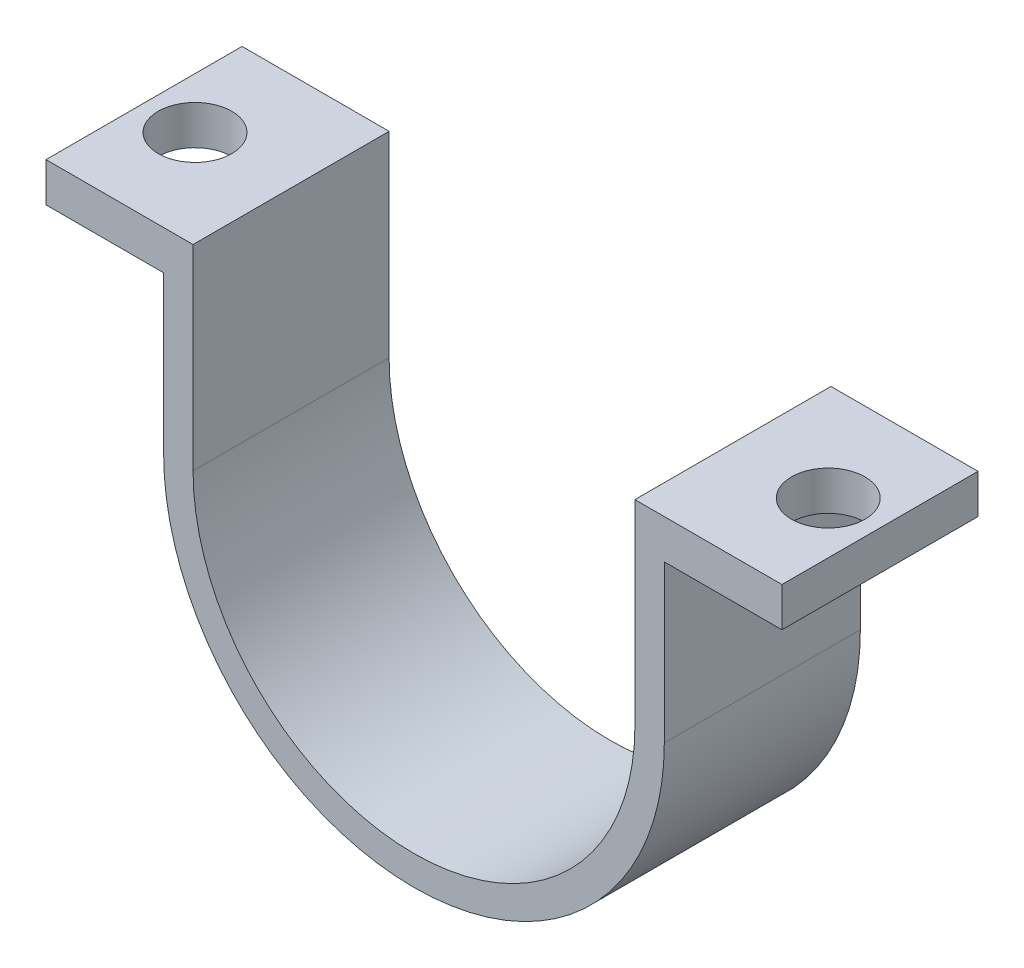
ISO-10303-21;
HEADER;
FILE_DESCRIPTION(('STEP AP214'),'2;1');
FILE_NAME('part.step','',(''),(''),'','','');
FILE_SCHEMA(('AUTOMOTIVE_DESIGN { 1 0 10303 214 1 1 1 1 }'));
ENDSEC;
DATA;
#1=APPLICATION_CONTEXT('core data for automotive mechanical design processes');
#2=APPLICATION_PROTOCOL_DEFINITION('international standard','automotive_design',2000,#1);
#3=PRODUCT_CONTEXT('',#1,'mechanical');
#4=PRODUCT('Part','Part','',(#3));
#5=PRODUCT_RELATED_PRODUCT_CATEGORY('part','',(#4));
#6=PRODUCT_DEFINITION_FORMATION('','',#4);
#7=PRODUCT_DEFINITION_CONTEXT('part definition',#1,'design');
#8=PRODUCT_DEFINITION('design','',#6,#7);
#9=PRODUCT_DEFINITION_SHAPE('','',#8);
#10=(LENGTH_UNIT() NAMED_UNIT(*) SI_UNIT(.MILLI.,.METRE.));
#11=(NAMED_UNIT(*) PLANE_ANGLE_UNIT() SI_UNIT($,.RADIAN.));
#12=(NAMED_UNIT(*) SI_UNIT($,.STERADIAN.) SOLID_ANGLE_UNIT());
#13=UNCERTAINTY_MEASURE_WITH_UNIT(LENGTH_MEASURE(1.E-05),#10,'distance_accuracy_value','');
#14=(GEOMETRIC_REPRESENTATION_CONTEXT(3) GLOBAL_UNCERTAINTY_ASSIGNED_CONTEXT((#13)) GLOBAL_UNIT_ASSIGNED_CONTEXT((#10,
#11,#12)) REPRESENTATION_CONTEXT('',''));
#15=CARTESIAN_POINT('',(0.,0.,0.));
#16=DIRECTION('',(0.,0.,1.));
#17=DIRECTION('',(1.,0.,0.));
#18=AXIS2_PLACEMENT_3D('',#15,#16,#17);
#19=CARTESIAN_POINT('',(0.0481877124280383,-5.08,25.4));
#20=DIRECTION('',(0.,0.,-1.));
#21=DIRECTION('',(-1.,0.,0.));
#22=AXIS2_PLACEMENT_3D('',#19,#20,#21);
#23=CYLINDRICAL_SURFACE('',#22,32.433187712428);
#24=CARTESIAN_POINT('',(0.0481877124280383,-5.08,0.));
#25=DIRECTION('',(0.,0.,1.));
#26=DIRECTION('',(-1.,0.,0.));
#27=AXIS2_PLACEMENT_3D('',#24,#25,#26);
#28=CIRCLE('',#27,32.433187712428);
#29=CARTESIAN_POINT('',(-32.3849999999999,-5.08,0.));
#30=VERTEX_POINT('',#29);
#31=CARTESIAN_POINT('',(32.481375424856,-5.08,0.));
#32=VERTEX_POINT('',#31);
#33=EDGE_CURVE('E165',#30,#32,#28,.T.);
#34=ORIENTED_EDGE('',*,*,#33,.T.);
#35=DIRECTION('',(0.,0.,-1.));
#36=VECTOR('',#35,1.);
#37=CARTESIAN_POINT('',(32.481375424856,-5.08,25.4));
#38=LINE('',#37,#36);
#39=CARTESIAN_POINT('',(32.481375424856,-5.08,25.4));
#40=VERTEX_POINT('',#39);
#41=EDGE_CURVE('E11',#40,#32,#38,.T.);
#42=ORIENTED_EDGE('',*,*,#41,.F.);
#43=CARTESIAN_POINT('',(0.0481877124280383,-5.08,25.4));
#44=DIRECTION('',(0.,0.,1.));
#45=DIRECTION('',(-1.,0.,0.));
#46=AXIS2_PLACEMENT_3D('',#43,#44,#45);
#47=CIRCLE('',#46,32.433187712428);
#48=CARTESIAN_POINT('',(-32.3849999999999,-5.08,25.4));
#49=VERTEX_POINT('',#48);
#50=EDGE_CURVE('E200',#49,#40,#47,.T.);
#51=ORIENTED_EDGE('',*,*,#50,.F.);
#52=DIRECTION('',(0.,0.,-1.));
#53=VECTOR('',#52,1.);
#54=CARTESIAN_POINT('',(-32.3849999999999,-5.08,25.4));
#55=LINE('',#54,#53);
#56=EDGE_CURVE('E161',#49,#30,#55,.T.);
#57=ORIENTED_EDGE('',*,*,#56,.T.);
#58=EDGE_LOOP('',(#34,#42,#51,#57));
#59=FACE_BOUND('',#58,.T.);
#60=ADVANCED_FACE('F39',(#59),#23,.T.);
#61=CARTESIAN_POINT('',(32.481375424856,-5.08,25.4));
#62=DIRECTION('',(-1.,0.,0.));
#63=DIRECTION('',(0.,-1.,0.));
#64=AXIS2_PLACEMENT_3D('',#61,#62,#63);
#65=PLANE('',#64);
#66=DIRECTION('',(0.,1.,0.));
#67=VECTOR('',#66,1.);
#68=CARTESIAN_POINT('',(32.481375424856,-5.08,0.));
#69=LINE('',#68,#67);
#70=CARTESIAN_POINT('',(32.481375424856,15.24,0.));
#71=VERTEX_POINT('',#70);
#72=EDGE_CURVE('E169',#32,#71,#69,.T.);
#73=ORIENTED_EDGE('',*,*,#72,.T.);
#74=DIRECTION('',(0.,0.,-1.));
#75=VECTOR('',#74,1.);
#76=CARTESIAN_POINT('',(32.481375424856,15.24,25.4));
#77=LINE('',#76,#75);
#78=CARTESIAN_POINT('',(32.481375424856,15.24,25.4));
#79=VERTEX_POINT('',#78);
#80=EDGE_CURVE('E49',#79,#71,#77,.T.);
#81=ORIENTED_EDGE('',*,*,#80,.F.);
#82=DIRECTION('',(0.,1.,0.));
#83=VECTOR('',#82,1.);
#84=CARTESIAN_POINT('',(32.481375424856,-5.08,25.4));
#85=LINE('',#84,#83);
#86=EDGE_CURVE('E112',#40,#79,#85,.T.);
#87=ORIENTED_EDGE('',*,*,#86,.F.);
#88=ORIENTED_EDGE('',*,*,#41,.T.);
#89=EDGE_LOOP('',(#73,#81,#87,#88));
#90=FACE_BOUND('',#89,.T.);
#91=ADVANCED_FACE('F296',(#90),#65,.F.);
#92=CARTESIAN_POINT('',(32.481375424856,15.24,25.4));
#93=DIRECTION('',(0.,1.,0.));
#94=DIRECTION('',(0.,0.,1.));
#95=AXIS2_PLACEMENT_3D('',#92,#93,#94);
#96=PLANE('',#95);
#97=CARTESIAN_POINT('',(41.021,15.24,12.7));
#98=DIRECTION('',(0.,1.,0.));
#99=DIRECTION('',(0.,0.,1.));
#100=AXIS2_PLACEMENT_3D('',#97,#98,#99);
#101=CIRCLE('',#100,4.7625);
#102=CARTESIAN_POINT('',(36.2585,15.24,12.7));
#103=VERTEX_POINT('',#102);
#104=EDGE_CURVE('E170',#103,#103,#101,.T.);
#105=ORIENTED_EDGE('',*,*,#104,.T.);
#106=EDGE_LOOP('',(#105));
#107=FACE_BOUND('',#106,.T.);
#108=DIRECTION('',(1.,0.,0.));
#109=VECTOR('',#108,1.);
#110=CARTESIAN_POINT('',(32.481375424856,15.24,0.));
#111=LINE('',#110,#109);
#112=CARTESIAN_POINT('',(47.721375424856,15.24,0.));
#113=VERTEX_POINT('',#112);
#114=EDGE_CURVE('E173',#71,#113,#111,.T.);
#115=ORIENTED_EDGE('',*,*,#114,.T.);
#116=DIRECTION('',(0.,0.,-1.));
#117=VECTOR('',#116,1.);
#118=CARTESIAN_POINT('',(47.721375424856,15.24,25.4));
#119=LINE('',#118,#117);
#120=CARTESIAN_POINT('',(47.721375424856,15.24,25.4));
#121=VERTEX_POINT('',#120);
#122=EDGE_CURVE('E227',#121,#113,#119,.T.);
#123=ORIENTED_EDGE('',*,*,#122,.F.);
#124=DIRECTION('',(1.,0.,0.));
#125=VECTOR('',#124,1.);
#126=CARTESIAN_POINT('',(32.481375424856,15.24,25.4));
#127=LINE('',#126,#125);
#128=EDGE_CURVE('E238',#79,#121,#127,.T.);
#129=ORIENTED_EDGE('',*,*,#128,.F.);
#130=ORIENTED_EDGE('',*,*,#80,.T.);
#131=EDGE_LOOP('',(#115,#123,#129,#130));
#132=FACE_BOUND('',#131,.T.);
#133=ADVANCED_FACE('F236',(#107,#132),#96,.F.);
#134=CARTESIAN_POINT('',(47.721375424856,15.24,25.4));
#135=DIRECTION('',(-1.,0.,0.));
#136=DIRECTION('',(0.,0.,1.));
#137=AXIS2_PLACEMENT_3D('',#134,#135,#136);
#138=PLANE('',#137);
#139=DIRECTION('',(0.,1.,0.));
#140=VECTOR('',#139,1.);
#141=CARTESIAN_POINT('',(47.721375424856,15.24,0.));
#142=LINE('',#141,#140);
#143=CARTESIAN_POINT('',(47.721375424856,20.32,0.));
#144=VERTEX_POINT('',#143);
#145=EDGE_CURVE('E176',#113,#144,#142,.T.);
#146=ORIENTED_EDGE('',*,*,#145,.T.);
#147=DIRECTION('',(0.,0.,-1.));
#148=VECTOR('',#147,1.);
#149=CARTESIAN_POINT('',(47.721375424856,20.32,25.4));
#150=LINE('',#149,#148);
#151=CARTESIAN_POINT('',(47.721375424856,20.32,25.4));
#152=VERTEX_POINT('',#151);
#153=EDGE_CURVE('E223',#152,#144,#150,.T.);
#154=ORIENTED_EDGE('',*,*,#153,.F.);
#155=DIRECTION('',(0.,1.,0.));
#156=VECTOR('',#155,1.);
#157=CARTESIAN_POINT('',(47.721375424856,15.24,25.4));
#158=LINE('',#157,#156);
#159=EDGE_CURVE('E257',#121,#152,#158,.T.);
#160=ORIENTED_EDGE('',*,*,#159,.F.);
#161=ORIENTED_EDGE('',*,*,#122,.T.);
#162=EDGE_LOOP('',(#146,#154,#160,#161));
#163=FACE_BOUND('',#162,.T.);
#164=ADVANCED_FACE('F247',(#163),#138,.F.);
#165=CARTESIAN_POINT('',(47.721375424856,20.32,25.4));
#166=DIRECTION('',(0.,-1.,0.));
#167=DIRECTION('',(1.,0.,0.));
#168=AXIS2_PLACEMENT_3D('',#165,#166,#167);
#169=PLANE('',#168);
#170=CARTESIAN_POINT('',(41.021,20.32,12.7));
#171=DIRECTION('',(0.,1.,0.));
#172=DIRECTION('',(-1.,0.,0.));
#173=AXIS2_PLACEMENT_3D('',#170,#171,#172);
#174=CIRCLE('',#173,4.7625);
#175=CARTESIAN_POINT('',(36.2585,20.32,12.7));
#176=VERTEX_POINT('',#175);
#177=EDGE_CURVE('E427',#176,#176,#174,.T.);
#178=ORIENTED_EDGE('',*,*,#177,.F.);
#179=EDGE_LOOP('',(#178));
#180=FACE_BOUND('',#179,.T.);
#181=DIRECTION('',(-1.,0.,0.));
#182=VECTOR('',#181,1.);
#183=CARTESIAN_POINT('',(47.721375424856,20.32,0.));
#184=LINE('',#183,#182);
#185=CARTESIAN_POINT('',(28.671375424856,20.32,0.));
#186=VERTEX_POINT('',#185);
#187=EDGE_CURVE('E179',#144,#186,#184,.T.);
#188=ORIENTED_EDGE('',*,*,#187,.T.);
#189=DIRECTION('',(0.,0.,-1.));
#190=VECTOR('',#189,1.);
#191=CARTESIAN_POINT('',(28.671375424856,20.32,25.4));
#192=LINE('',#191,#190);
#193=CARTESIAN_POINT('',(28.671375424856,20.32,25.4));
#194=VERTEX_POINT('',#193);
#195=EDGE_CURVE('E219',#194,#186,#192,.T.);
#196=ORIENTED_EDGE('',*,*,#195,.F.);
#197=DIRECTION('',(-1.,0.,0.));
#198=VECTOR('',#197,1.);
#199=CARTESIAN_POINT('',(47.721375424856,20.32,25.4));
#200=LINE('',#199,#198);
#201=EDGE_CURVE('E253',#152,#194,#200,.T.);
#202=ORIENTED_EDGE('',*,*,#201,.F.);
#203=ORIENTED_EDGE('',*,*,#153,.T.);
#204=EDGE_LOOP('',(#188,#196,#202,#203));
#205=FACE_BOUND('',#204,.T.);
#206=ADVANCED_FACE('F251',(#180,#205),#169,.F.);
#207=CARTESIAN_POINT('',(28.671375424856,20.32,25.4));
#208=DIRECTION('',(1.,0.,0.));
#209=DIRECTION('',(0.,1.,0.));
#210=AXIS2_PLACEMENT_3D('',#207,#208,#209);
#211=PLANE('',#210);
#212=DIRECTION('',(0.,-1.,0.));
#213=VECTOR('',#212,1.);
#214=CARTESIAN_POINT('',(28.671375424856,20.32,0.));
#215=LINE('',#214,#213);
#216=CARTESIAN_POINT('',(28.671375424856,-5.07999999999999,0.));
#217=VERTEX_POINT('',#216);
#218=EDGE_CURVE('E182',#186,#217,#215,.T.);
#219=ORIENTED_EDGE('',*,*,#218,.T.);
#220=DIRECTION('',(0.,0.,-1.));
#221=VECTOR('',#220,1.);
#222=CARTESIAN_POINT('',(28.671375424856,-5.07999999999999,25.4));
#223=LINE('',#222,#221);
#224=CARTESIAN_POINT('',(28.671375424856,-5.07999999999999,25.4));
#225=VERTEX_POINT('',#224);
#226=EDGE_CURVE('E215',#225,#217,#223,.T.);
#227=ORIENTED_EDGE('',*,*,#226,.F.);
#228=DIRECTION('',(0.,-1.,0.));
#229=VECTOR('',#228,1.);
#230=CARTESIAN_POINT('',(28.671375424856,20.32,25.4));
#231=LINE('',#230,#229);
#232=EDGE_CURVE('E256',#194,#225,#231,.T.);
#233=ORIENTED_EDGE('',*,*,#232,.F.);
#234=ORIENTED_EDGE('',*,*,#195,.T.);
#235=EDGE_LOOP('',(#219,#227,#233,#234));
#236=FACE_BOUND('',#235,.T.);
#237=ADVANCED_FACE('F310',(#236),#211,.F.);
#238=CARTESIAN_POINT('',(0.0481877124280132,-5.08,25.4));
#239=DIRECTION('',(0.,0.,-1.));
#240=DIRECTION('',(-1.,0.,0.));
#241=AXIS2_PLACEMENT_3D('',#238,#239,#240);
#242=CYLINDRICAL_SURFACE('',#241,28.623187712428);
#243=CARTESIAN_POINT('',(0.0481877124280132,-5.08,0.));
#244=DIRECTION('',(0.,0.,-1.));
#245=DIRECTION('',(1.,0.,0.));
#246=AXIS2_PLACEMENT_3D('',#243,#244,#245);
#247=CIRCLE('',#246,28.623187712428);
#248=CARTESIAN_POINT('',(-28.575,-5.07999999999993,0.));
#249=VERTEX_POINT('',#248);
#250=EDGE_CURVE('E185',#217,#249,#247,.T.);
#251=ORIENTED_EDGE('',*,*,#250,.T.);
#252=DIRECTION('',(0.,0.,-1.));
#253=VECTOR('',#252,1.);
#254=CARTESIAN_POINT('',(-28.575,-5.07999999999993,25.4));
#255=LINE('',#254,#253);
#256=CARTESIAN_POINT('',(-28.575,-5.07999999999993,25.4));
#257=VERTEX_POINT('',#256);
#258=EDGE_CURVE('E211',#257,#249,#255,.T.);
#259=ORIENTED_EDGE('',*,*,#258,.F.);
#260=CARTESIAN_POINT('',(0.0481877124280132,-5.08,25.4));
#261=DIRECTION('',(0.,0.,-1.));
#262=DIRECTION('',(1.,0.,0.));
#263=AXIS2_PLACEMENT_3D('',#260,#261,#262);
#264=CIRCLE('',#263,28.623187712428);
#265=EDGE_CURVE('E261',#225,#257,#264,.T.);
#266=ORIENTED_EDGE('',*,*,#265,.F.);
#267=ORIENTED_EDGE('',*,*,#226,.T.);
#268=EDGE_LOOP('',(#251,#259,#266,#267));
#269=FACE_BOUND('',#268,.T.);
#270=ADVANCED_FACE('F314',(#269),#242,.F.);
#271=CARTESIAN_POINT('',(-28.5749999999999,20.32,25.4));
#272=DIRECTION('',(-1.,0.,0.));
#273=DIRECTION('',(0.,-1.,0.));
#274=AXIS2_PLACEMENT_3D('',#271,#272,#273);
#275=PLANE('',#274);
#276=DIRECTION('',(0.,1.,0.));
#277=VECTOR('',#276,1.);
#278=CARTESIAN_POINT('',(-28.5749999999999,20.32,0.));
#279=LINE('',#278,#277);
#280=CARTESIAN_POINT('',(-28.5749999999999,20.32,0.));
#281=VERTEX_POINT('',#280);
#282=EDGE_CURVE('E188',#249,#281,#279,.T.);
#283=ORIENTED_EDGE('',*,*,#282,.T.);
#284=DIRECTION('',(0.,0.,-1.));
#285=VECTOR('',#284,1.);
#286=CARTESIAN_POINT('',(-28.5749999999999,20.32,25.4));
#287=LINE('',#286,#285);
#288=CARTESIAN_POINT('',(-28.5749999999999,20.32,25.4));
#289=VERTEX_POINT('',#288);
#290=EDGE_CURVE('E207',#289,#281,#287,.T.);
#291=ORIENTED_EDGE('',*,*,#290,.F.);
#292=DIRECTION('',(0.,1.,0.));
#293=VECTOR('',#292,1.);
#294=CARTESIAN_POINT('',(-28.5749999999999,20.32,25.4));
#295=LINE('',#294,#293);
#296=EDGE_CURVE('E268',#257,#289,#295,.T.);
#297=ORIENTED_EDGE('',*,*,#296,.F.);
#298=ORIENTED_EDGE('',*,*,#258,.T.);
#299=EDGE_LOOP('',(#283,#291,#297,#298));
#300=FACE_BOUND('',#299,.T.);
#301=ADVANCED_FACE('F276',(#300),#275,.F.);
#302=CARTESIAN_POINT('',(-47.6249999999999,20.32,25.4));
#303=DIRECTION('',(0.,-1.,0.));
#304=DIRECTION('',(0.,0.,-1.));
#305=AXIS2_PLACEMENT_3D('',#302,#303,#304);
#306=PLANE('',#305);
#307=CARTESIAN_POINT('',(-41.021,20.32,12.7));
#308=DIRECTION('',(0.,1.,0.));
#309=DIRECTION('',(-1.,0.,0.));
#310=AXIS2_PLACEMENT_3D('',#307,#308,#309);
#311=CIRCLE('',#310,4.7625);
#312=CARTESIAN_POINT('',(-45.7835,20.32,12.7));
#313=VERTEX_POINT('',#312);
#314=EDGE_CURVE('E434',#313,#313,#311,.T.);
#315=ORIENTED_EDGE('',*,*,#314,.F.);
#316=EDGE_LOOP('',(#315));
#317=FACE_BOUND('',#316,.T.);
#318=DIRECTION('',(-1.,0.,0.));
#319=VECTOR('',#318,1.);
#320=CARTESIAN_POINT('',(-47.6249999999999,20.32,0.));
#321=LINE('',#320,#319);
#322=CARTESIAN_POINT('',(-47.6249999999999,20.32,0.));
#323=VERTEX_POINT('',#322);
#324=EDGE_CURVE('E191',#281,#323,#321,.T.);
#325=ORIENTED_EDGE('',*,*,#324,.T.);
#326=DIRECTION('',(0.,0.,-1.));
#327=VECTOR('',#326,1.);
#328=CARTESIAN_POINT('',(-47.6249999999999,20.32,25.4));
#329=LINE('',#328,#327);
#330=CARTESIAN_POINT('',(-47.6249999999999,20.32,25.4));
#331=VERTEX_POINT('',#330);
#332=EDGE_CURVE('E154',#331,#323,#329,.T.);
#333=ORIENTED_EDGE('',*,*,#332,.F.);
#334=DIRECTION('',(-1.,0.,0.));
#335=VECTOR('',#334,1.);
#336=CARTESIAN_POINT('',(-47.6249999999999,20.32,25.4));
#337=LINE('',#336,#335);
#338=EDGE_CURVE('E143',#289,#331,#337,.T.);
#339=ORIENTED_EDGE('',*,*,#338,.F.);
#340=ORIENTED_EDGE('',*,*,#290,.T.);
#341=EDGE_LOOP('',(#325,#333,#339,#340));
#342=FACE_BOUND('',#341,.T.);
#343=ADVANCED_FACE('F280',(#317,#342),#306,.F.);
#344=CARTESIAN_POINT('',(-47.6249999999999,15.24,25.4));
#345=DIRECTION('',(1.,0.,0.));
#346=DIRECTION('',(0.,0.,-1.));
#347=AXIS2_PLACEMENT_3D('',#344,#345,#346);
#348=PLANE('',#347);
#349=DIRECTION('',(0.,-1.,0.));
#350=VECTOR('',#349,1.);
#351=CARTESIAN_POINT('',(-47.6249999999999,15.24,0.));
#352=LINE('',#351,#350);
#353=CARTESIAN_POINT('',(-47.6249999999999,15.24,0.));
#354=VERTEX_POINT('',#353);
#355=EDGE_CURVE('E152',#323,#354,#352,.T.);
#356=ORIENTED_EDGE('',*,*,#355,.T.);
#357=DIRECTION('',(0.,0.,-1.));
#358=VECTOR('',#357,1.);
#359=CARTESIAN_POINT('',(-47.6249999999999,15.24,25.4));
#360=LINE('',#359,#358);
#361=CARTESIAN_POINT('',(-47.6249999999999,15.24,25.4));
#362=VERTEX_POINT('',#361);
#363=EDGE_CURVE('E149',#362,#354,#360,.T.);
#364=ORIENTED_EDGE('',*,*,#363,.F.);
#365=DIRECTION('',(0.,-1.,0.));
#366=VECTOR('',#365,1.);
#367=CARTESIAN_POINT('',(-47.6249999999999,15.24,25.4));
#368=LINE('',#367,#366);
#369=EDGE_CURVE('E137',#331,#362,#368,.T.);
#370=ORIENTED_EDGE('',*,*,#369,.F.);
#371=ORIENTED_EDGE('',*,*,#332,.T.);
#372=EDGE_LOOP('',(#356,#364,#370,#371));
#373=FACE_BOUND('',#372,.T.);
#374=ADVANCED_FACE('F150',(#373),#348,.F.);
#375=CARTESIAN_POINT('',(-32.3849999999999,15.24,25.4));
#376=DIRECTION('',(0.,1.,0.));
#377=DIRECTION('',(-1.,0.,0.));
#378=AXIS2_PLACEMENT_3D('',#375,#376,#377);
#379=PLANE('',#378);
#380=CARTESIAN_POINT('',(-41.021,15.24,12.7));
#381=DIRECTION('',(0.,1.,0.));
#382=DIRECTION('',(-1.,0.,0.));
#383=AXIS2_PLACEMENT_3D('',#380,#381,#382);
#384=CIRCLE('',#383,4.7625);
#385=CARTESIAN_POINT('',(-45.7835,15.24,12.7));
#386=VERTEX_POINT('',#385);
#387=EDGE_CURVE('E42',#386,#386,#384,.T.);
#388=ORIENTED_EDGE('',*,*,#387,.T.);
#389=EDGE_LOOP('',(#388));
#390=FACE_BOUND('',#389,.T.);
#391=DIRECTION('',(1.,0.,0.));
#392=VECTOR('',#391,1.);
#393=CARTESIAN_POINT('',(-32.3849999999999,15.24,0.));
#394=LINE('',#393,#392);
#395=CARTESIAN_POINT('',(-32.3849999999999,15.24,0.));
#396=VERTEX_POINT('',#395);
#397=EDGE_CURVE('E98',#354,#396,#394,.T.);
#398=ORIENTED_EDGE('',*,*,#397,.T.);
#399=DIRECTION('',(0.,0.,-1.));
#400=VECTOR('',#399,1.);
#401=CARTESIAN_POINT('',(-32.3849999999999,15.24,25.4));
#402=LINE('',#401,#400);
#403=CARTESIAN_POINT('',(-32.3849999999999,15.24,25.4));
#404=VERTEX_POINT('',#403);
#405=EDGE_CURVE('E155',#404,#396,#402,.T.);
#406=ORIENTED_EDGE('',*,*,#405,.F.);
#407=DIRECTION('',(1.,0.,0.));
#408=VECTOR('',#407,1.);
#409=CARTESIAN_POINT('',(-32.3849999999999,15.24,25.4));
#410=LINE('',#409,#408);
#411=EDGE_CURVE('E141',#362,#404,#410,.T.);
#412=ORIENTED_EDGE('',*,*,#411,.F.);
#413=ORIENTED_EDGE('',*,*,#363,.T.);
#414=EDGE_LOOP('',(#398,#406,#412,#413));
#415=FACE_BOUND('',#414,.T.);
#416=ADVANCED_FACE('F157',(#390,#415),#379,.F.);
#417=CARTESIAN_POINT('',(-32.3849999999999,-5.08,25.4));
#418=DIRECTION('',(1.,0.,0.));
#419=DIRECTION('',(0.,1.,0.));
#420=AXIS2_PLACEMENT_3D('',#417,#418,#419);
#421=PLANE('',#420);
#422=DIRECTION('',(0.,-1.,0.));
#423=VECTOR('',#422,1.);
#424=CARTESIAN_POINT('',(-32.3849999999999,-5.08,0.));
#425=LINE('',#424,#423);
#426=EDGE_CURVE('E104',#396,#30,#425,.T.);
#427=ORIENTED_EDGE('',*,*,#426,.T.);
#428=ORIENTED_EDGE('',*,*,#56,.F.);
#429=DIRECTION('',(0.,-1.,0.));
#430=VECTOR('',#429,1.);
#431=CARTESIAN_POINT('',(-32.3849999999999,-5.08,25.4));
#432=LINE('',#431,#430);
#433=EDGE_CURVE('E57',#404,#49,#432,.T.);
#434=ORIENTED_EDGE('',*,*,#433,.F.);
#435=ORIENTED_EDGE('',*,*,#405,.T.);
#436=EDGE_LOOP('',(#427,#428,#434,#435));
#437=FACE_BOUND('',#436,.T.);
#438=ADVANCED_FACE('F284',(#437),#421,.F.);
#439=CARTESIAN_POINT('',(0.0481877124280383,-5.08,25.4));
#440=DIRECTION('',(0.,0.,-1.));
#441=DIRECTION('',(-1.,0.,0.));
#442=AXIS2_PLACEMENT_3D('',#439,#440,#441);
#443=PLANE('',#442);
#444=ORIENTED_EDGE('',*,*,#50,.T.);
#445=ORIENTED_EDGE('',*,*,#86,.T.);
#446=ORIENTED_EDGE('',*,*,#128,.T.);
#447=ORIENTED_EDGE('',*,*,#159,.T.);
#448=ORIENTED_EDGE('',*,*,#201,.T.);
#449=ORIENTED_EDGE('',*,*,#232,.T.);
#450=ORIENTED_EDGE('',*,*,#265,.T.);
#451=ORIENTED_EDGE('',*,*,#296,.T.);
#452=ORIENTED_EDGE('',*,*,#338,.T.);
#453=ORIENTED_EDGE('',*,*,#369,.T.);
#454=ORIENTED_EDGE('',*,*,#411,.T.);
#455=ORIENTED_EDGE('',*,*,#433,.T.);
#456=EDGE_LOOP('',(#444,#445,#446,#447,#448,#449,#450,#451,#452,#453,#454,#455));
#457=FACE_BOUND('',#456,.T.);
#458=ADVANCED_FACE('F139',(#457),#443,.F.);
#459=CARTESIAN_POINT('',(0.0481877124280383,-5.08,0.));
#460=DIRECTION('',(0.,0.,-1.));
#461=DIRECTION('',(-1.,0.,0.));
#462=AXIS2_PLACEMENT_3D('',#459,#460,#461);
#463=PLANE('',#462);
#464=ORIENTED_EDGE('',*,*,#33,.F.);
#465=ORIENTED_EDGE('',*,*,#426,.F.);
#466=ORIENTED_EDGE('',*,*,#397,.F.);
#467=ORIENTED_EDGE('',*,*,#355,.F.);
#468=ORIENTED_EDGE('',*,*,#324,.F.);
#469=ORIENTED_EDGE('',*,*,#282,.F.);
#470=ORIENTED_EDGE('',*,*,#250,.F.);
#471=ORIENTED_EDGE('',*,*,#218,.F.);
#472=ORIENTED_EDGE('',*,*,#187,.F.);
#473=ORIENTED_EDGE('',*,*,#145,.F.);
#474=ORIENTED_EDGE('',*,*,#114,.F.);
#475=ORIENTED_EDGE('',*,*,#72,.F.);
#476=EDGE_LOOP('',(#464,#465,#466,#467,#468,#469,#470,#471,#472,#473,#474,#475));
#477=FACE_BOUND('',#476,.T.);
#478=ADVANCED_FACE('F242',(#477),#463,.T.);
#479=CARTESIAN_POINT('',(-41.021,-17.78,12.7));
#480=DIRECTION('',(0.,1.,0.));
#481=DIRECTION('',(-1.,0.,0.));
#482=AXIS2_PLACEMENT_3D('',#479,#480,#481);
#483=CYLINDRICAL_SURFACE('',#482,4.7625);
#484=CARTESIAN_POINT('',(-45.7835,20.32,12.7));
#485=CARTESIAN_POINT('',(-45.7835,20.2670833333333,12.7));
#486=CARTESIAN_POINT('',(-45.7835,20.2141666666667,12.7));
#487=CARTESIAN_POINT('',(-45.7835,20.1083333333333,12.7));
#488=CARTESIAN_POINT('',(-45.7835,20.0554166666667,12.7));
#489=CARTESIAN_POINT('',(-45.7835,19.9495833333333,12.7));
#490=CARTESIAN_POINT('',(-45.7835,19.8966666666667,12.7));
#491=CARTESIAN_POINT('',(-45.7835,19.7908333333333,12.7));
#492=CARTESIAN_POINT('',(-45.7835,19.7379166666667,12.7));
#493=CARTESIAN_POINT('',(-45.7835,19.6320833333333,12.7));
#494=CARTESIAN_POINT('',(-45.7835,19.5791666666667,12.7));
#495=CARTESIAN_POINT('',(-45.7835,19.4733333333333,12.7));
#496=CARTESIAN_POINT('',(-45.7835,19.4204166666667,12.7));
#497=CARTESIAN_POINT('',(-45.7835,19.3145833333333,12.7));
#498=CARTESIAN_POINT('',(-45.7835,19.2616666666667,12.7));
#499=CARTESIAN_POINT('',(-45.7835,19.1558333333333,12.7));
#500=CARTESIAN_POINT('',(-45.7835,19.1029166666667,12.7));
#501=CARTESIAN_POINT('',(-45.7835,18.9970833333333,12.7));
#502=CARTESIAN_POINT('',(-45.7835,18.9441666666667,12.7));
#503=CARTESIAN_POINT('',(-45.7835,18.8383333333333,12.7));
#504=CARTESIAN_POINT('',(-45.7835,18.7854166666667,12.7));
#505=CARTESIAN_POINT('',(-45.7835,18.6795833333333,12.7));
#506=CARTESIAN_POINT('',(-45.7835,18.6266666666667,12.7));
#507=CARTESIAN_POINT('',(-45.7835,18.5208333333333,12.7));
#508=CARTESIAN_POINT('',(-45.7835,18.4679166666667,12.7));
#509=CARTESIAN_POINT('',(-45.7835,18.3620833333333,12.7));
#510=CARTESIAN_POINT('',(-45.7835,18.3091666666667,12.7));
#511=CARTESIAN_POINT('',(-45.7835,18.2033333333333,12.7));
#512=CARTESIAN_POINT('',(-45.7835,18.1504166666667,12.7));
#513=CARTESIAN_POINT('',(-45.7835,18.0445833333333,12.7));
#514=CARTESIAN_POINT('',(-45.7835,17.9916666666667,12.7));
#515=CARTESIAN_POINT('',(-45.7835,17.8858333333333,12.7));
#516=CARTESIAN_POINT('',(-45.7835,17.8329166666667,12.7));
#517=CARTESIAN_POINT('',(-45.7835,17.7270833333333,12.7));
#518=CARTESIAN_POINT('',(-45.7835,17.6741666666667,12.7));
#519=CARTESIAN_POINT('',(-45.7835,17.5683333333333,12.7));
#520=CARTESIAN_POINT('',(-45.7835,17.5154166666667,12.7));
#521=CARTESIAN_POINT('',(-45.7835,17.4095833333333,12.7));
#522=CARTESIAN_POINT('',(-45.7835,17.3566666666667,12.7));
#523=CARTESIAN_POINT('',(-45.7835,17.2508333333333,12.7));
#524=CARTESIAN_POINT('',(-45.7835,17.1979166666667,12.7));
#525=CARTESIAN_POINT('',(-45.7835,17.0920833333333,12.7));
#526=CARTESIAN_POINT('',(-45.7835,17.0391666666667,12.7));
#527=CARTESIAN_POINT('',(-45.7835,16.9333333333333,12.7));
#528=CARTESIAN_POINT('',(-45.7835,16.8804166666667,12.7));
#529=CARTESIAN_POINT('',(-45.7835,16.7745833333333,12.7));
#530=CARTESIAN_POINT('',(-45.7835,16.7216666666667,12.7));
#531=CARTESIAN_POINT('',(-45.7835,16.6158333333333,12.7));
#532=CARTESIAN_POINT('',(-45.7835,16.5629166666667,12.7));
#533=CARTESIAN_POINT('',(-45.7835,16.4570833333333,12.7));
#534=CARTESIAN_POINT('',(-45.7835,16.4041666666667,12.7));
#535=CARTESIAN_POINT('',(-45.7835,16.2983333333333,12.7));
#536=CARTESIAN_POINT('',(-45.7835,16.2454166666667,12.7));
#537=CARTESIAN_POINT('',(-45.7835,16.1395833333333,12.7));
#538=CARTESIAN_POINT('',(-45.7835,16.0866666666667,12.7));
#539=CARTESIAN_POINT('',(-45.7835,15.9808333333333,12.7));
#540=CARTESIAN_POINT('',(-45.7835,15.9279166666667,12.7));
#541=CARTESIAN_POINT('',(-45.7835,15.8220833333333,12.7));
#542=CARTESIAN_POINT('',(-45.7835,15.7691666666667,12.7));
#543=CARTESIAN_POINT('',(-45.7835,15.6633333333333,12.7));
#544=CARTESIAN_POINT('',(-45.7835,15.6104166666667,12.7));
#545=CARTESIAN_POINT('',(-45.7835,15.5045833333333,12.7));
#546=CARTESIAN_POINT('',(-45.7835,15.4516666666667,12.7));
#547=CARTESIAN_POINT('',(-45.7835,15.3458333333333,12.7));
#548=CARTESIAN_POINT('',(-45.7835,15.2929166666667,12.7));
#549=CARTESIAN_POINT('',(-45.7835,15.24,12.7));
#550=B_SPLINE_CURVE_WITH_KNOTS('',3,(#484,#485,#486,#487,#488,#489,#490,#491,#492,#493,#494,
#495,#496,#497,#498,#499,#500,#501,#502,#503,#504,#505,#506,#507,#508,#509,#510,#511,#512,#513,
#514,#515,#516,#517,#518,#519,#520,#521,#522,#523,#524,#525,#526,#527,#528,#529,#530,#531,#532,
#533,#534,#535,#536,#537,#538,#539,#540,#541,#542,#543,#544,#545,#546,#547,#548,#549),
.UNSPECIFIED.,.F.,.F.,(4,2,2,2,2,2,2,2,2,2,2,2,2,2,2,2,2,2,2,2,2,2,2,2,2,2,2,2,2,2,2,2,4),(0.,
0.158749999999999,0.317499999999998,0.476250000000004,0.635000000000004,0.793750000000003,
0.952500000000002,1.11125,1.27000000000001,1.42875000000001,1.58750000000001,1.74625,1.905,
2.06375,2.22250000000001,2.38125000000001,2.54000000000001,2.69875000000001,2.85750000000001,
3.01625000000001,3.17500000000001,3.33375000000001,3.49250000000001,3.65125000000001,
3.81000000000001,3.96875000000001,4.12750000000001,4.28625000000001,4.44500000000001,
4.60375000000002,4.76250000000002,4.92125000000002,5.08000000000002),.UNSPECIFIED.);
#551=EDGE_CURVE('BSEAM343',#313,#386,#550,.T.);
#552=ORIENTED_EDGE('',*,*,#314,.T.);
#553=ORIENTED_EDGE('',*,*,#387,.F.);
#554=ORIENTED_EDGE('',*,*,#551,.T.);
#555=ORIENTED_EDGE('',*,*,#551,.F.);
#556=EDGE_LOOP('',(#552,#554,#553,#555));
#557=FACE_BOUND('',#556,.T.);
#558=ADVANCED_FACE('F343',(#557),#483,.F.);
#559=CARTESIAN_POINT('',(41.021,-17.78,12.7));
#560=DIRECTION('',(0.,1.,0.));
#561=DIRECTION('',(-1.,0.,0.));
#562=AXIS2_PLACEMENT_3D('',#559,#560,#561);
#563=CYLINDRICAL_SURFACE('',#562,4.7625);
#564=CARTESIAN_POINT('',(36.2585,20.32,12.7));
#565=CARTESIAN_POINT('',(36.2585,20.2670833333333,12.7));
#566=CARTESIAN_POINT('',(36.2585,20.2141666666667,12.7));
#567=CARTESIAN_POINT('',(36.2585,20.1083333333333,12.7));
#568=CARTESIAN_POINT('',(36.2585,20.0554166666667,12.7));
#569=CARTESIAN_POINT('',(36.2585,19.9495833333333,12.7));
#570=CARTESIAN_POINT('',(36.2585,19.8966666666667,12.7));
#571=CARTESIAN_POINT('',(36.2585,19.7908333333333,12.7));
#572=CARTESIAN_POINT('',(36.2585,19.7379166666667,12.7));
#573=CARTESIAN_POINT('',(36.2585,19.6320833333333,12.7));
#574=CARTESIAN_POINT('',(36.2585,19.5791666666667,12.7));
#575=CARTESIAN_POINT('',(36.2585,19.4733333333333,12.7));
#576=CARTESIAN_POINT('',(36.2585,19.4204166666667,12.7));
#577=CARTESIAN_POINT('',(36.2585,19.3145833333333,12.7));
#578=CARTESIAN_POINT('',(36.2585,19.2616666666667,12.7));
#579=CARTESIAN_POINT('',(36.2585,19.1558333333333,12.7));
#580=CARTESIAN_POINT('',(36.2585,19.1029166666667,12.7));
#581=CARTESIAN_POINT('',(36.2585,18.9970833333333,12.7));
#582=CARTESIAN_POINT('',(36.2585,18.9441666666667,12.7));
#583=CARTESIAN_POINT('',(36.2585,18.8383333333333,12.7));
#584=CARTESIAN_POINT('',(36.2585,18.7854166666667,12.7));
#585=CARTESIAN_POINT('',(36.2585,18.6795833333333,12.7));
#586=CARTESIAN_POINT('',(36.2585,18.6266666666667,12.7));
#587=CARTESIAN_POINT('',(36.2585,18.5208333333333,12.7));
#588=CARTESIAN_POINT('',(36.2585,18.4679166666667,12.7));
#589=CARTESIAN_POINT('',(36.2585,18.3620833333333,12.7));
#590=CARTESIAN_POINT('',(36.2585,18.3091666666667,12.7));
#591=CARTESIAN_POINT('',(36.2585,18.2033333333333,12.7));
#592=CARTESIAN_POINT('',(36.2585,18.1504166666667,12.7));
#593=CARTESIAN_POINT('',(36.2585,18.0445833333333,12.7));
#594=CARTESIAN_POINT('',(36.2585,17.9916666666667,12.7));
#595=CARTESIAN_POINT('',(36.2585,17.8858333333333,12.7));
#596=CARTESIAN_POINT('',(36.2585,17.8329166666667,12.7));
#597=CARTESIAN_POINT('',(36.2585,17.7270833333333,12.7));
#598=CARTESIAN_POINT('',(36.2585,17.6741666666667,12.7));
#599=CARTESIAN_POINT('',(36.2585,17.5683333333333,12.7));
#600=CARTESIAN_POINT('',(36.2585,17.5154166666667,12.7));
#601=CARTESIAN_POINT('',(36.2585,17.4095833333333,12.7));
#602=CARTESIAN_POINT('',(36.2585,17.3566666666667,12.7));
#603=CARTESIAN_POINT('',(36.2585,17.2508333333333,12.7));
#604=CARTESIAN_POINT('',(36.2585,17.1979166666667,12.7));
#605=CARTESIAN_POINT('',(36.2585,17.0920833333333,12.7));
#606=CARTESIAN_POINT('',(36.2585,17.0391666666667,12.7));
#607=CARTESIAN_POINT('',(36.2585,16.9333333333333,12.7));
#608=CARTESIAN_POINT('',(36.2585,16.8804166666667,12.7));
#609=CARTESIAN_POINT('',(36.2585,16.7745833333333,12.7));
#610=CARTESIAN_POINT('',(36.2585,16.7216666666667,12.7));
#611=CARTESIAN_POINT('',(36.2585,16.6158333333333,12.7));
#612=CARTESIAN_POINT('',(36.2585,16.5629166666667,12.7));
#613=CARTESIAN_POINT('',(36.2585,16.4570833333333,12.7));
#614=CARTESIAN_POINT('',(36.2585,16.4041666666667,12.7));
#615=CARTESIAN_POINT('',(36.2585,16.2983333333333,12.7));
#616=CARTESIAN_POINT('',(36.2585,16.2454166666667,12.7));
#617=CARTESIAN_POINT('',(36.2585,16.1395833333333,12.7));
#618=CARTESIAN_POINT('',(36.2585,16.0866666666667,12.7));
#619=CARTESIAN_POINT('',(36.2585,15.9808333333333,12.7));
#620=CARTESIAN_POINT('',(36.2585,15.9279166666667,12.7));
#621=CARTESIAN_POINT('',(36.2585,15.8220833333333,12.7));
#622=CARTESIAN_POINT('',(36.2585,15.7691666666667,12.7));
#623=CARTESIAN_POINT('',(36.2585,15.6633333333333,12.7));
#624=CARTESIAN_POINT('',(36.2585,15.6104166666667,12.7));
#625=CARTESIAN_POINT('',(36.2585,15.5045833333333,12.7));
#626=CARTESIAN_POINT('',(36.2585,15.4516666666667,12.7));
#627=CARTESIAN_POINT('',(36.2585,15.3458333333333,12.7));
#628=CARTESIAN_POINT('',(36.2585,15.2929166666667,12.7));
#629=CARTESIAN_POINT('',(36.2585,15.24,12.7));
#630=B_SPLINE_CURVE_WITH_KNOTS('',3,(#564,#565,#566,#567,#568,#569,#570,#571,#572,#573,#574,
#575,#576,#577,#578,#579,#580,#581,#582,#583,#584,#585,#586,#587,#588,#589,#590,#591,#592,#593,
#594,#595,#596,#597,#598,#599,#600,#601,#602,#603,#604,#605,#606,#607,#608,#609,#610,#611,#612,
#613,#614,#615,#616,#617,#618,#619,#620,#621,#622,#623,#624,#625,#626,#627,#628,#629),
.UNSPECIFIED.,.F.,.F.,(4,2,2,2,2,2,2,2,2,2,2,2,2,2,2,2,2,2,2,2,2,2,2,2,2,2,2,2,2,2,2,2,4),(0.,
0.158749999999999,0.317499999999998,0.476249999999998,0.634999999999997,0.793750000000003,
0.952500000000002,1.11125,1.27,1.42875,1.5875,1.74625,1.905,2.06375,2.2225,2.38125,2.54,2.69875,
2.8575,3.01625,3.175,3.33375,3.4925,3.65125,3.81,3.96875,4.1275,4.28625,4.445,4.60375,4.7625,
4.92125,5.08),.UNSPECIFIED.);
#631=EDGE_CURVE('BSEAM348',#176,#103,#630,.T.);
#632=ORIENTED_EDGE('',*,*,#177,.T.);
#633=ORIENTED_EDGE('',*,*,#104,.F.);
#634=ORIENTED_EDGE('',*,*,#631,.T.);
#635=ORIENTED_EDGE('',*,*,#631,.F.);
#636=EDGE_LOOP('',(#632,#634,#633,#635));
#637=FACE_BOUND('',#636,.T.);
#638=ADVANCED_FACE('F348',(#637),#563,.F.);
#639=CLOSED_SHELL('',(#60,#91,#133,#164,#206,#237,#270,#301,#343,#374,#416,#438,#458,#478,#558,#638));
#640=MANIFOLD_SOLID_BREP('B2',#639);
#641=ADVANCED_BREP_SHAPE_REPRESENTATION('',(#18,#640),#14);
#642=SHAPE_DEFINITION_REPRESENTATION(#9,#641);
ENDSEC;
END-ISO-10303-21;
